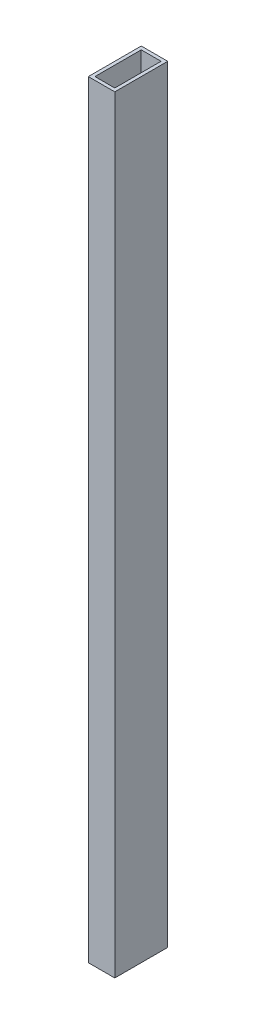
ISO-10303-21;
HEADER;
FILE_DESCRIPTION(('STEP AP214'),'2;1');
FILE_NAME('part.step','',(''),(''),'','','');
FILE_SCHEMA(('AUTOMOTIVE_DESIGN { 1 0 10303 214 1 1 1 1 }'));
ENDSEC;
DATA;
#1=APPLICATION_CONTEXT('core data for automotive mechanical design processes');
#2=APPLICATION_PROTOCOL_DEFINITION('international standard','automotive_design',2000,#1);
#3=PRODUCT_CONTEXT('',#1,'mechanical');
#4=PRODUCT('Part','Part','',(#3));
#5=PRODUCT_RELATED_PRODUCT_CATEGORY('part','',(#4));
#6=PRODUCT_DEFINITION_FORMATION('','',#4);
#7=PRODUCT_DEFINITION_CONTEXT('part definition',#1,'design');
#8=PRODUCT_DEFINITION('design','',#6,#7);
#9=PRODUCT_DEFINITION_SHAPE('','',#8);
#10=(LENGTH_UNIT() NAMED_UNIT(*) SI_UNIT(.MILLI.,.METRE.));
#11=(NAMED_UNIT(*) PLANE_ANGLE_UNIT() SI_UNIT($,.RADIAN.));
#12=(NAMED_UNIT(*) SI_UNIT($,.STERADIAN.) SOLID_ANGLE_UNIT());
#13=UNCERTAINTY_MEASURE_WITH_UNIT(LENGTH_MEASURE(1.E-05),#10,'distance_accuracy_value','');
#14=(GEOMETRIC_REPRESENTATION_CONTEXT(3) GLOBAL_UNCERTAINTY_ASSIGNED_CONTEXT((#13)) GLOBAL_UNIT_ASSIGNED_CONTEXT((#10,
#11,#12)) REPRESENTATION_CONTEXT('',''));
#15=CARTESIAN_POINT('',(0.,0.,0.));
#16=DIRECTION('',(0.,0.,1.));
#17=DIRECTION('',(1.,0.,0.));
#18=AXIS2_PLACEMENT_3D('',#15,#16,#17);
#19=CARTESIAN_POINT('',(0.,736.6,0.));
#20=DIRECTION('',(0.,-1.,0.));
#21=DIRECTION('',(0.,0.,-1.));
#22=AXIS2_PLACEMENT_3D('',#19,#20,#21);
#23=PLANE('',#22);
#24=DIRECTION('',(0.,0.,-1.));
#25=VECTOR('',#24,1.);
#26=CARTESIAN_POINT('',(12.7,736.6,25.4));
#27=LINE('',#26,#25);
#28=CARTESIAN_POINT('',(12.7,736.6,25.4));
#29=VERTEX_POINT('',#28);
#30=CARTESIAN_POINT('',(12.7,736.6,-25.4));
#31=VERTEX_POINT('',#30);
#32=EDGE_CURVE('E159',#29,#31,#27,.T.);
#33=ORIENTED_EDGE('',*,*,#32,.T.);
#34=DIRECTION('',(-1.,0.,0.));
#35=VECTOR('',#34,1.);
#36=CARTESIAN_POINT('',(-12.7,736.6,-25.4));
#37=LINE('',#36,#35);
#38=CARTESIAN_POINT('',(-12.7,736.6,-25.4));
#39=VERTEX_POINT('',#38);
#40=EDGE_CURVE('E163',#31,#39,#37,.T.);
#41=ORIENTED_EDGE('',*,*,#40,.T.);
#42=DIRECTION('',(0.,0.,1.));
#43=VECTOR('',#42,1.);
#44=CARTESIAN_POINT('',(-12.7,736.6,25.4));
#45=LINE('',#44,#43);
#46=CARTESIAN_POINT('',(-12.7,736.6,25.4));
#47=VERTEX_POINT('',#46);
#48=EDGE_CURVE('E167',#39,#47,#45,.T.);
#49=ORIENTED_EDGE('',*,*,#48,.T.);
#50=DIRECTION('',(1.,0.,0.));
#51=VECTOR('',#50,1.);
#52=CARTESIAN_POINT('',(-12.7,736.6,25.4));
#53=LINE('',#52,#51);
#54=EDGE_CURVE('E170',#47,#29,#53,.T.);
#55=ORIENTED_EDGE('',*,*,#54,.T.);
#56=EDGE_LOOP('',(#33,#41,#49,#55));
#57=FACE_BOUND('',#56,.T.);
#58=DIRECTION('',(1.,0.,0.));
#59=VECTOR('',#58,1.);
#60=CARTESIAN_POINT('',(-9.525,736.6,22.225));
#61=LINE('',#60,#59);
#62=CARTESIAN_POINT('',(-9.525,736.6,22.225));
#63=VERTEX_POINT('',#62);
#64=CARTESIAN_POINT('',(9.525,736.6,22.225));
#65=VERTEX_POINT('',#64);
#66=EDGE_CURVE('E111',#63,#65,#61,.T.);
#67=ORIENTED_EDGE('',*,*,#66,.F.);
#68=DIRECTION('',(0.,0.,1.));
#69=VECTOR('',#68,1.);
#70=CARTESIAN_POINT('',(-9.525,736.6,22.225));
#71=LINE('',#70,#69);
#72=CARTESIAN_POINT('',(-9.525,736.6,-22.225));
#73=VERTEX_POINT('',#72);
#74=EDGE_CURVE('E137',#73,#63,#71,.T.);
#75=ORIENTED_EDGE('',*,*,#74,.F.);
#76=DIRECTION('',(-1.,0.,0.));
#77=VECTOR('',#76,1.);
#78=CARTESIAN_POINT('',(-9.525,736.6,-22.225));
#79=LINE('',#78,#77);
#80=CARTESIAN_POINT('',(9.525,736.6,-22.225));
#81=VERTEX_POINT('',#80);
#82=EDGE_CURVE('E133',#81,#73,#79,.T.);
#83=ORIENTED_EDGE('',*,*,#82,.F.);
#84=DIRECTION('',(0.,0.,-1.));
#85=VECTOR('',#84,1.);
#86=CARTESIAN_POINT('',(9.525,736.6,22.225));
#87=LINE('',#86,#85);
#88=EDGE_CURVE('E120',#65,#81,#87,.T.);
#89=ORIENTED_EDGE('',*,*,#88,.F.);
#90=EDGE_LOOP('',(#67,#75,#83,#89));
#91=FACE_BOUND('',#90,.T.);
#92=ADVANCED_FACE('F45',(#57,#91),#23,.F.);
#93=CARTESIAN_POINT('',(0.,0.,0.));
#94=DIRECTION('',(0.,-1.,0.));
#95=DIRECTION('',(0.,0.,-1.));
#96=AXIS2_PLACEMENT_3D('',#93,#94,#95);
#97=PLANE('',#96);
#98=DIRECTION('',(0.,0.,-1.));
#99=VECTOR('',#98,1.);
#100=CARTESIAN_POINT('',(12.7,0.,25.4));
#101=LINE('',#100,#99);
#102=CARTESIAN_POINT('',(12.7,0.,25.4));
#103=VERTEX_POINT('',#102);
#104=CARTESIAN_POINT('',(12.7,0.,-25.4));
#105=VERTEX_POINT('',#104);
#106=EDGE_CURVE('E129',#103,#105,#101,.T.);
#107=ORIENTED_EDGE('',*,*,#106,.F.);
#108=DIRECTION('',(1.,0.,0.));
#109=VECTOR('',#108,1.);
#110=CARTESIAN_POINT('',(-12.7,0.,25.4));
#111=LINE('',#110,#109);
#112=CARTESIAN_POINT('',(-12.7,0.,25.4));
#113=VERTEX_POINT('',#112);
#114=EDGE_CURVE('E164',#113,#103,#111,.T.);
#115=ORIENTED_EDGE('',*,*,#114,.F.);
#116=DIRECTION('',(0.,0.,1.));
#117=VECTOR('',#116,1.);
#118=CARTESIAN_POINT('',(-12.7,0.,25.4));
#119=LINE('',#118,#117);
#120=CARTESIAN_POINT('',(-12.7,0.,-25.4));
#121=VERTEX_POINT('',#120);
#122=EDGE_CURVE('E180',#121,#113,#119,.T.);
#123=ORIENTED_EDGE('',*,*,#122,.F.);
#124=DIRECTION('',(-1.,0.,0.));
#125=VECTOR('',#124,1.);
#126=CARTESIAN_POINT('',(-12.7,0.,-25.4));
#127=LINE('',#126,#125);
#128=EDGE_CURVE('E177',#105,#121,#127,.T.);
#129=ORIENTED_EDGE('',*,*,#128,.F.);
#130=EDGE_LOOP('',(#107,#115,#123,#129));
#131=FACE_BOUND('',#130,.T.);
#132=DIRECTION('',(0.,0.,1.));
#133=VECTOR('',#132,1.);
#134=CARTESIAN_POINT('',(-9.525,0.,22.225));
#135=LINE('',#134,#133);
#136=CARTESIAN_POINT('',(-9.525,0.,-22.225));
#137=VERTEX_POINT('',#136);
#138=CARTESIAN_POINT('',(-9.525,0.,22.225));
#139=VERTEX_POINT('',#138);
#140=EDGE_CURVE('E121',#137,#139,#135,.T.);
#141=ORIENTED_EDGE('',*,*,#140,.T.);
#142=DIRECTION('',(1.,0.,0.));
#143=VECTOR('',#142,1.);
#144=CARTESIAN_POINT('',(-9.525,0.,22.225));
#145=LINE('',#144,#143);
#146=CARTESIAN_POINT('',(9.525,0.,22.225));
#147=VERTEX_POINT('',#146);
#148=EDGE_CURVE('E69',#139,#147,#145,.T.);
#149=ORIENTED_EDGE('',*,*,#148,.T.);
#150=DIRECTION('',(0.,0.,-1.));
#151=VECTOR('',#150,1.);
#152=CARTESIAN_POINT('',(9.525,0.,22.225));
#153=LINE('',#152,#151);
#154=CARTESIAN_POINT('',(9.525,0.,-22.225));
#155=VERTEX_POINT('',#154);
#156=EDGE_CURVE('E127',#147,#155,#153,.T.);
#157=ORIENTED_EDGE('',*,*,#156,.T.);
#158=DIRECTION('',(-1.,0.,0.));
#159=VECTOR('',#158,1.);
#160=CARTESIAN_POINT('',(-9.525,0.,-22.225));
#161=LINE('',#160,#159);
#162=EDGE_CURVE('E146',#155,#137,#161,.T.);
#163=ORIENTED_EDGE('',*,*,#162,.T.);
#164=EDGE_LOOP('',(#141,#149,#157,#163));
#165=FACE_BOUND('',#164,.T.);
#166=ADVANCED_FACE('F203',(#131,#165),#97,.T.);
#167=CARTESIAN_POINT('',(12.7,736.6,25.4));
#168=DIRECTION('',(-1.,0.,0.));
#169=DIRECTION('',(0.,0.,1.));
#170=AXIS2_PLACEMENT_3D('',#167,#168,#169);
#171=PLANE('',#170);
#172=ORIENTED_EDGE('',*,*,#106,.T.);
#173=DIRECTION('',(0.,-1.,0.));
#174=VECTOR('',#173,1.);
#175=CARTESIAN_POINT('',(12.7,736.6,-25.4));
#176=LINE('',#175,#174);
#177=EDGE_CURVE('E11',#31,#105,#176,.T.);
#178=ORIENTED_EDGE('',*,*,#177,.F.);
#179=ORIENTED_EDGE('',*,*,#32,.F.);
#180=DIRECTION('',(0.,-1.,0.));
#181=VECTOR('',#180,1.);
#182=CARTESIAN_POINT('',(12.7,736.6,25.4));
#183=LINE('',#182,#181);
#184=EDGE_CURVE('E173',#29,#103,#183,.T.);
#185=ORIENTED_EDGE('',*,*,#184,.T.);
#186=EDGE_LOOP('',(#172,#178,#179,#185));
#187=FACE_BOUND('',#186,.T.);
#188=ADVANCED_FACE('F47',(#187),#171,.F.);
#189=CARTESIAN_POINT('',(-12.7,736.6,-25.4));
#190=DIRECTION('',(0.,0.,1.));
#191=DIRECTION('',(1.,0.,0.));
#192=AXIS2_PLACEMENT_3D('',#189,#190,#191);
#193=PLANE('',#192);
#194=ORIENTED_EDGE('',*,*,#128,.T.);
#195=DIRECTION('',(0.,-1.,0.));
#196=VECTOR('',#195,1.);
#197=CARTESIAN_POINT('',(-12.7,736.6,-25.4));
#198=LINE('',#197,#196);
#199=EDGE_CURVE('E54',#39,#121,#198,.T.);
#200=ORIENTED_EDGE('',*,*,#199,.F.);
#201=ORIENTED_EDGE('',*,*,#40,.F.);
#202=ORIENTED_EDGE('',*,*,#177,.T.);
#203=EDGE_LOOP('',(#194,#200,#201,#202));
#204=FACE_BOUND('',#203,.T.);
#205=ADVANCED_FACE('F213',(#204),#193,.F.);
#206=CARTESIAN_POINT('',(-12.7,736.6,25.4));
#207=DIRECTION('',(1.,0.,0.));
#208=DIRECTION('',(0.,0.,-1.));
#209=AXIS2_PLACEMENT_3D('',#206,#207,#208);
#210=PLANE('',#209);
#211=ORIENTED_EDGE('',*,*,#122,.T.);
#212=DIRECTION('',(0.,-1.,0.));
#213=VECTOR('',#212,1.);
#214=CARTESIAN_POINT('',(-12.7,736.6,25.4));
#215=LINE('',#214,#213);
#216=EDGE_CURVE('E188',#47,#113,#215,.T.);
#217=ORIENTED_EDGE('',*,*,#216,.F.);
#218=ORIENTED_EDGE('',*,*,#48,.F.);
#219=ORIENTED_EDGE('',*,*,#199,.T.);
#220=EDGE_LOOP('',(#211,#217,#218,#219));
#221=FACE_BOUND('',#220,.T.);
#222=ADVANCED_FACE('F197',(#221),#210,.F.);
#223=CARTESIAN_POINT('',(-12.7,736.6,25.4));
#224=DIRECTION('',(0.,0.,-1.));
#225=DIRECTION('',(-1.,0.,0.));
#226=AXIS2_PLACEMENT_3D('',#223,#224,#225);
#227=PLANE('',#226);
#228=ORIENTED_EDGE('',*,*,#114,.T.);
#229=ORIENTED_EDGE('',*,*,#184,.F.);
#230=ORIENTED_EDGE('',*,*,#54,.F.);
#231=ORIENTED_EDGE('',*,*,#216,.T.);
#232=EDGE_LOOP('',(#228,#229,#230,#231));
#233=FACE_BOUND('',#232,.T.);
#234=ADVANCED_FACE('F207',(#233),#227,.F.);
#235=CARTESIAN_POINT('',(-9.525,736.6,22.225));
#236=DIRECTION('',(0.,0.,-1.));
#237=DIRECTION('',(-1.,0.,0.));
#238=AXIS2_PLACEMENT_3D('',#235,#236,#237);
#239=PLANE('',#238);
#240=ORIENTED_EDGE('',*,*,#148,.F.);
#241=DIRECTION('',(0.,-1.,0.));
#242=VECTOR('',#241,1.);
#243=CARTESIAN_POINT('',(-9.525,736.6,22.225));
#244=LINE('',#243,#242);
#245=EDGE_CURVE('E115',#63,#139,#244,.T.);
#246=ORIENTED_EDGE('',*,*,#245,.F.);
#247=ORIENTED_EDGE('',*,*,#66,.T.);
#248=DIRECTION('',(0.,-1.,0.));
#249=VECTOR('',#248,1.);
#250=CARTESIAN_POINT('',(9.525,736.6,22.225));
#251=LINE('',#250,#249);
#252=EDGE_CURVE('E114',#65,#147,#251,.T.);
#253=ORIENTED_EDGE('',*,*,#252,.T.);
#254=EDGE_LOOP('',(#240,#246,#247,#253));
#255=FACE_BOUND('',#254,.T.);
#256=ADVANCED_FACE('F113',(#255),#239,.T.);
#257=CARTESIAN_POINT('',(9.525,736.6,22.225));
#258=DIRECTION('',(-1.,0.,0.));
#259=DIRECTION('',(0.,0.,1.));
#260=AXIS2_PLACEMENT_3D('',#257,#258,#259);
#261=PLANE('',#260);
#262=ORIENTED_EDGE('',*,*,#156,.F.);
#263=ORIENTED_EDGE('',*,*,#252,.F.);
#264=ORIENTED_EDGE('',*,*,#88,.T.);
#265=DIRECTION('',(0.,-1.,0.));
#266=VECTOR('',#265,1.);
#267=CARTESIAN_POINT('',(9.525,736.6,-22.225));
#268=LINE('',#267,#266);
#269=EDGE_CURVE('E130',#81,#155,#268,.T.);
#270=ORIENTED_EDGE('',*,*,#269,.T.);
#271=EDGE_LOOP('',(#262,#263,#264,#270));
#272=FACE_BOUND('',#271,.T.);
#273=ADVANCED_FACE('F124',(#272),#261,.T.);
#274=CARTESIAN_POINT('',(-9.525,736.6,-22.225));
#275=DIRECTION('',(0.,0.,1.));
#276=DIRECTION('',(1.,0.,0.));
#277=AXIS2_PLACEMENT_3D('',#274,#275,#276);
#278=PLANE('',#277);
#279=ORIENTED_EDGE('',*,*,#162,.F.);
#280=ORIENTED_EDGE('',*,*,#269,.F.);
#281=ORIENTED_EDGE('',*,*,#82,.T.);
#282=DIRECTION('',(0.,-1.,0.));
#283=VECTOR('',#282,1.);
#284=CARTESIAN_POINT('',(-9.525,736.6,-22.225));
#285=LINE('',#284,#283);
#286=EDGE_CURVE('E61',#73,#137,#285,.T.);
#287=ORIENTED_EDGE('',*,*,#286,.T.);
#288=EDGE_LOOP('',(#279,#280,#281,#287));
#289=FACE_BOUND('',#288,.T.);
#290=ADVANCED_FACE('F236',(#289),#278,.T.);
#291=CARTESIAN_POINT('',(-9.525,736.6,22.225));
#292=DIRECTION('',(1.,0.,0.));
#293=DIRECTION('',(0.,0.,-1.));
#294=AXIS2_PLACEMENT_3D('',#291,#292,#293);
#295=PLANE('',#294);
#296=ORIENTED_EDGE('',*,*,#140,.F.);
#297=ORIENTED_EDGE('',*,*,#286,.F.);
#298=ORIENTED_EDGE('',*,*,#74,.T.);
#299=ORIENTED_EDGE('',*,*,#245,.T.);
#300=EDGE_LOOP('',(#296,#297,#298,#299));
#301=FACE_BOUND('',#300,.T.);
#302=ADVANCED_FACE('F240',(#301),#295,.T.);
#303=CLOSED_SHELL('',(#92,#166,#188,#205,#222,#234,#256,#273,#290,#302));
#304=MANIFOLD_SOLID_BREP('B2',#303);
#305=ADVANCED_BREP_SHAPE_REPRESENTATION('',(#18,#304),#14);
#306=SHAPE_DEFINITION_REPRESENTATION(#9,#305);
ENDSEC;
END-ISO-10303-21;
